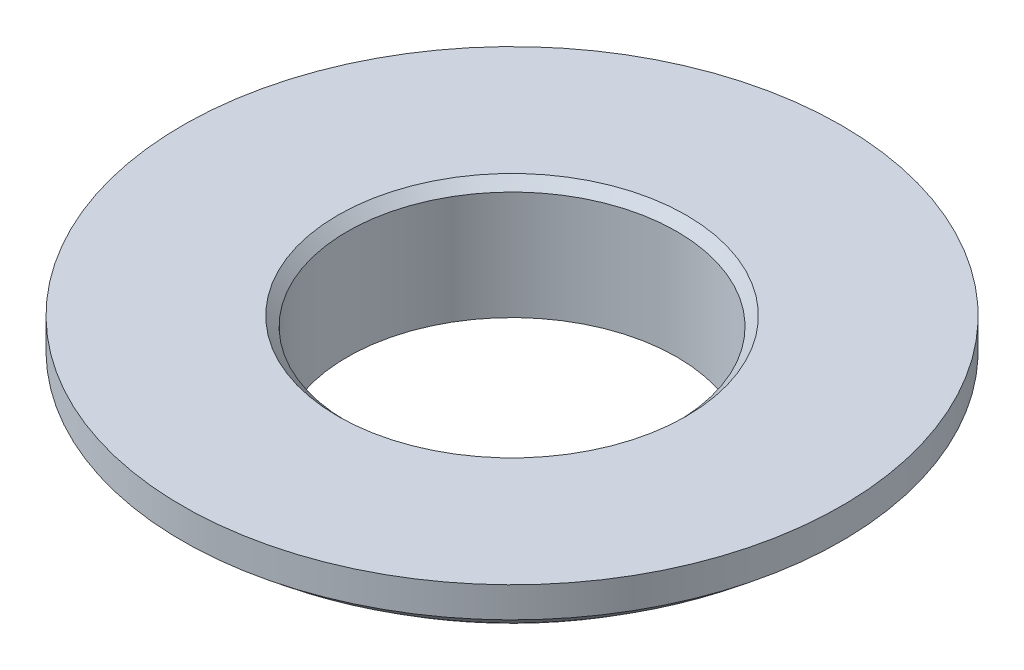
ISO-10303-21;
HEADER;
FILE_DESCRIPTION(('STEP AP214'),'2;1');
FILE_NAME('part.step','',(''),(''),'','','');
FILE_SCHEMA(('AUTOMOTIVE_DESIGN { 1 0 10303 214 1 1 1 1 }'));
ENDSEC;
DATA;
#1=APPLICATION_CONTEXT('core data for automotive mechanical design processes');
#2=APPLICATION_PROTOCOL_DEFINITION('international standard','automotive_design',2000,#1);
#3=PRODUCT_CONTEXT('',#1,'mechanical');
#4=PRODUCT('Part','Part','',(#3));
#5=PRODUCT_RELATED_PRODUCT_CATEGORY('part','',(#4));
#6=PRODUCT_DEFINITION_FORMATION('','',#4);
#7=PRODUCT_DEFINITION_CONTEXT('part definition',#1,'design');
#8=PRODUCT_DEFINITION('design','',#6,#7);
#9=PRODUCT_DEFINITION_SHAPE('','',#8);
#10=(LENGTH_UNIT() NAMED_UNIT(*) SI_UNIT(.MILLI.,.METRE.));
#11=(NAMED_UNIT(*) PLANE_ANGLE_UNIT() SI_UNIT($,.RADIAN.));
#12=(NAMED_UNIT(*) SI_UNIT($,.STERADIAN.) SOLID_ANGLE_UNIT());
#13=UNCERTAINTY_MEASURE_WITH_UNIT(LENGTH_MEASURE(1.E-05),#10,'distance_accuracy_value','');
#14=(GEOMETRIC_REPRESENTATION_CONTEXT(3) GLOBAL_UNCERTAINTY_ASSIGNED_CONTEXT((#13)) GLOBAL_UNIT_ASSIGNED_CONTEXT((#10,
#11,#12)) REPRESENTATION_CONTEXT('',''));
#15=CARTESIAN_POINT('',(0.,0.,0.));
#16=DIRECTION('',(0.,0.,1.));
#17=DIRECTION('',(1.,0.,0.));
#18=AXIS2_PLACEMENT_3D('',#15,#16,#17);
#19=CARTESIAN_POINT('',(0.,-2.43948246188906,0.));
#20=DIRECTION('',(0.,-1.,0.));
#21=DIRECTION('',(0.,0.,-1.));
#22=AXIS2_PLACEMENT_3D('',#19,#20,#21);
#23=CYLINDRICAL_SURFACE('',#22,5.25000000000001);
#24=CARTESIAN_POINT('',(0.,2.13948246188906,0.));
#25=DIRECTION('',(0.,-1.,0.));
#26=DIRECTION('',(0.,0.,-1.));
#27=AXIS2_PLACEMENT_3D('',#24,#25,#26);
#28=CIRCLE('',#27,5.25000000000001);
#29=CARTESIAN_POINT('',(0.,2.13948246188906,-5.25000000000001));
#30=VERTEX_POINT('',#29);
#31=EDGE_CURVE('E43',#30,#30,#28,.F.);
#32=ORIENTED_EDGE('',*,*,#31,.T.);
#33=EDGE_LOOP('',(#32));
#34=FACE_BOUND('',#33,.T.);
#35=CARTESIAN_POINT('',(0.,-1.3246588481527,0.));
#36=DIRECTION('',(0.,1.,0.));
#37=DIRECTION('',(0.,0.,1.));
#38=AXIS2_PLACEMENT_3D('',#35,#36,#37);
#39=CIRCLE('',#38,5.25000000000001);
#40=CARTESIAN_POINT('',(0.,-1.3246588481527,5.25000000000001));
#41=VERTEX_POINT('',#40);
#42=EDGE_CURVE('E47',#41,#41,#39,.F.);
#43=ORIENTED_EDGE('',*,*,#42,.T.);
#44=EDGE_LOOP('',(#43));
#45=FACE_BOUND('',#44,.T.);
#46=ADVANCED_FACE('F35',(#34,#45),#23,.F.);
#47=CARTESIAN_POINT('',(0.,2.43948246188906,5.25));
#48=DIRECTION('',(0.,-1.,0.));
#49=DIRECTION('',(0.,0.,-1.));
#50=AXIS2_PLACEMENT_3D('',#47,#48,#49);
#51=PLANE('',#50);
#52=CARTESIAN_POINT('',(0.,2.43948246188906,0.));
#53=DIRECTION('',(0.,-1.,0.));
#54=DIRECTION('',(0.,0.,-1.));
#55=AXIS2_PLACEMENT_3D('',#52,#53,#54);
#56=CIRCLE('',#55,5.55000000000001);
#57=CARTESIAN_POINT('',(0.,2.43948246188906,-5.55000000000001));
#58=VERTEX_POINT('',#57);
#59=EDGE_CURVE('E51',#58,#58,#56,.T.);
#60=ORIENTED_EDGE('',*,*,#59,.T.);
#61=EDGE_LOOP('',(#60));
#62=FACE_BOUND('',#61,.T.);
#63=CARTESIAN_POINT('',(0.,2.43948246188906,0.));
#64=DIRECTION('',(0.,-1.,0.));
#65=DIRECTION('',(0.,0.,-1.));
#66=AXIS2_PLACEMENT_3D('',#63,#64,#65);
#67=CIRCLE('',#66,10.5);
#68=CARTESIAN_POINT('',(0.,2.43948246188906,-10.5));
#69=VERTEX_POINT('',#68);
#70=EDGE_CURVE('E56',#69,#69,#67,.T.);
#71=ORIENTED_EDGE('',*,*,#70,.F.);
#72=EDGE_LOOP('',(#71));
#73=FACE_BOUND('',#72,.T.);
#74=ADVANCED_FACE('F68',(#62,#73),#51,.F.);
#75=CARTESIAN_POINT('',(0.,-2.43948246188906,0.));
#76=DIRECTION('',(0.,-1.,0.));
#77=DIRECTION('',(0.,0.,-1.));
#78=AXIS2_PLACEMENT_3D('',#75,#76,#77);
#79=CYLINDRICAL_SURFACE('',#78,10.5);
#80=CARTESIAN_POINT('',(0.,1.47057137513463,0.));
#81=DIRECTION('',(0.,-1.,0.));
#82=DIRECTION('',(0.,0.,-1.));
#83=AXIS2_PLACEMENT_3D('',#80,#81,#82);
#84=CIRCLE('',#83,10.5);
#85=CARTESIAN_POINT('',(0.,1.47057137513463,-10.5));
#86=VERTEX_POINT('',#85);
#87=EDGE_CURVE('E59',#86,#86,#84,.T.);
#88=ORIENTED_EDGE('',*,*,#87,.F.);
#89=EDGE_LOOP('',(#88));
#90=FACE_BOUND('',#89,.T.);
#91=ORIENTED_EDGE('',*,*,#70,.T.);
#92=EDGE_LOOP('',(#91));
#93=FACE_BOUND('',#92,.T.);
#94=ADVANCED_FACE('F65',(#90,#93),#79,.T.);
#95=CARTESIAN_POINT('',(0.,13.5605175381109,0.));
#96=DIRECTION('',(0.,-1.,0.));
#97=DIRECTION('',(0.,0.,-1.));
#98=AXIS2_PLACEMENT_3D('',#95,#96,#97);
#99=DEGENERATE_TOROIDAL_SURFACE('',#98,0.0198663283174428,16.,.T.);
#100=CARTESIAN_POINT('',(0.,-1.46074560702042,0.));
#101=DIRECTION('',(0.,1.,0.));
#102=DIRECTION('',(0.,0.,1.));
#103=AXIS2_PLACEMENT_3D('',#100,#101,#102);
#104=CIRCLE('',#103,5.53000729971905);
#105=CARTESIAN_POINT('',(0.,-1.46074560702042,5.53000729971905));
#106=VERTEX_POINT('',#105);
#107=EDGE_CURVE('E10',#106,#106,#104,.T.);
#108=ORIENTED_EDGE('',*,*,#107,.T.);
#109=EDGE_LOOP('',(#108));
#110=FACE_BOUND('',#109,.T.);
#111=ORIENTED_EDGE('',*,*,#87,.T.);
#112=EDGE_LOOP('',(#111));
#113=FACE_BOUND('',#112,.T.);
#114=ADVANCED_FACE('F63',(#110,#113),#99,.T.);
#115=CARTESIAN_POINT('',(0.,2.43948246188906,0.));
#116=DIRECTION('',(0.,1.,0.));
#117=DIRECTION('',(0.,0.,1.));
#118=AXIS2_PLACEMENT_3D('',#115,#116,#117);
#119=CONICAL_SURFACE('',#118,5.55000000000001,0.78539816339745);
#120=ORIENTED_EDGE('',*,*,#31,.F.);
#121=EDGE_LOOP('',(#120));
#122=FACE_BOUND('',#121,.T.);
#123=ORIENTED_EDGE('',*,*,#59,.F.);
#124=EDGE_LOOP('',(#123));
#125=FACE_BOUND('',#124,.T.);
#126=ADVANCED_FACE('F81',(#122,#125),#119,.F.);
#127=CARTESIAN_POINT('',(0.,-1.3246588481527,0.));
#128=DIRECTION('',(0.,-1.,0.));
#129=DIRECTION('',(0.,0.,-1.));
#130=AXIS2_PLACEMENT_3D('',#127,#128,#129);
#131=CONICAL_SURFACE('',#130,5.25000000000001,1.11840203773749);
#132=ORIENTED_EDGE('',*,*,#107,.F.);
#133=EDGE_LOOP('',(#132));
#134=FACE_BOUND('',#133,.T.);
#135=ORIENTED_EDGE('',*,*,#42,.F.);
#136=EDGE_LOOP('',(#135));
#137=FACE_BOUND('',#136,.T.);
#138=ADVANCED_FACE('F38',(#134,#137),#131,.F.);
#139=CLOSED_SHELL('',(#46,#74,#94,#114,#126,#138));
#140=MANIFOLD_SOLID_BREP('B2',#139);
#141=ADVANCED_BREP_SHAPE_REPRESENTATION('',(#18,#140),#14);
#142=SHAPE_DEFINITION_REPRESENTATION(#9,#141);
ENDSEC;
END-ISO-10303-21;
